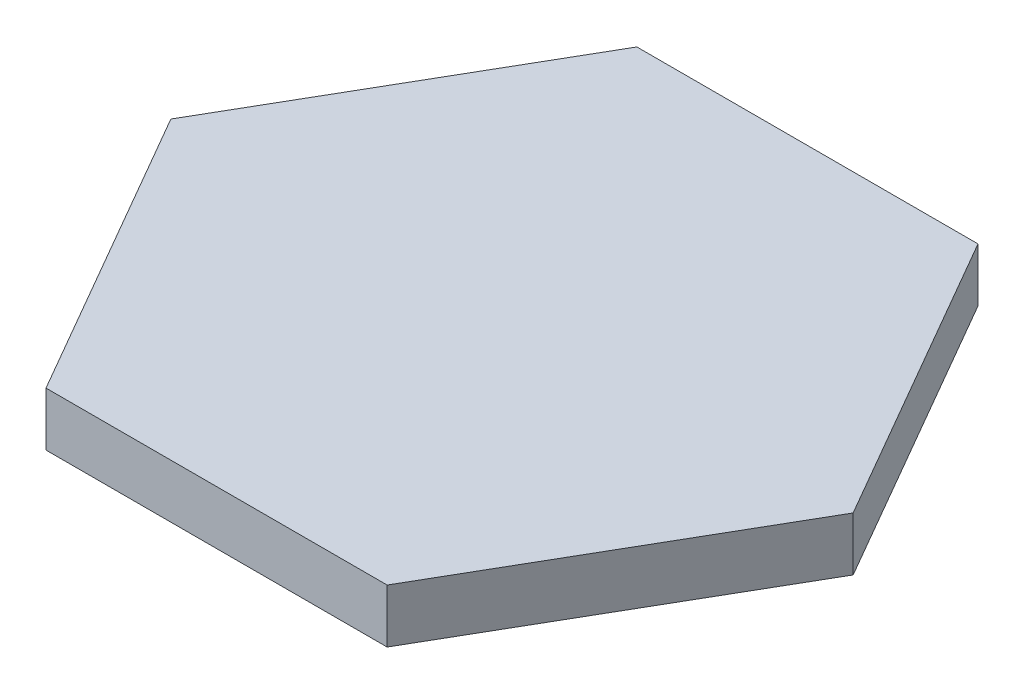
ISO-10303-21;
HEADER;
FILE_DESCRIPTION(('STEP AP214'),'2;1');
FILE_NAME('part.step','',(''),(''),'','','');
FILE_SCHEMA(('AUTOMOTIVE_DESIGN { 1 0 10303 214 1 1 1 1 }'));
ENDSEC;
DATA;
#1=APPLICATION_CONTEXT('core data for automotive mechanical design processes');
#2=APPLICATION_PROTOCOL_DEFINITION('international standard','automotive_design',2000,#1);
#3=PRODUCT_CONTEXT('',#1,'mechanical');
#4=PRODUCT('Part','Part','',(#3));
#5=PRODUCT_RELATED_PRODUCT_CATEGORY('part','',(#4));
#6=PRODUCT_DEFINITION_FORMATION('','',#4);
#7=PRODUCT_DEFINITION_CONTEXT('part definition',#1,'design');
#8=PRODUCT_DEFINITION('design','',#6,#7);
#9=PRODUCT_DEFINITION_SHAPE('','',#8);
#10=(LENGTH_UNIT() NAMED_UNIT(*) SI_UNIT(.MILLI.,.METRE.));
#11=(NAMED_UNIT(*) PLANE_ANGLE_UNIT() SI_UNIT($,.RADIAN.));
#12=(NAMED_UNIT(*) SI_UNIT($,.STERADIAN.) SOLID_ANGLE_UNIT());
#13=UNCERTAINTY_MEASURE_WITH_UNIT(LENGTH_MEASURE(1.E-05),#10,'distance_accuracy_value','');
#14=(GEOMETRIC_REPRESENTATION_CONTEXT(3) GLOBAL_UNCERTAINTY_ASSIGNED_CONTEXT((#13)) GLOBAL_UNIT_ASSIGNED_CONTEXT((#10,
#11,#12)) REPRESENTATION_CONTEXT('',''));
#15=CARTESIAN_POINT('',(0.,0.,0.));
#16=DIRECTION('',(0.,0.,1.));
#17=DIRECTION('',(1.,0.,0.));
#18=AXIS2_PLACEMENT_3D('',#15,#16,#17);
#19=CARTESIAN_POINT('',(-40.3279163028954,12.7,69.85));
#20=DIRECTION('',(0.,0.,-1.));
#21=DIRECTION('',(-1.,0.,0.));
#22=AXIS2_PLACEMENT_3D('',#19,#20,#21);
#23=PLANE('',#22);
#24=DIRECTION('',(1.,0.,0.));
#25=VECTOR('',#24,1.);
#26=CARTESIAN_POINT('',(-40.3279163028954,0.,69.85));
#27=LINE('',#26,#25);
#28=CARTESIAN_POINT('',(-40.3279163028954,0.,69.85));
#29=VERTEX_POINT('',#28);
#30=CARTESIAN_POINT('',(40.3279163028954,0.,69.85));
#31=VERTEX_POINT('',#30);
#32=EDGE_CURVE('E140',#29,#31,#27,.T.);
#33=ORIENTED_EDGE('',*,*,#32,.T.);
#34=DIRECTION('',(0.,-1.,0.));
#35=VECTOR('',#34,1.);
#36=CARTESIAN_POINT('',(40.3279163028954,12.7,69.85));
#37=LINE('',#36,#35);
#38=CARTESIAN_POINT('',(40.3279163028954,12.7,69.85));
#39=VERTEX_POINT('',#38);
#40=EDGE_CURVE('E11',#39,#31,#37,.T.);
#41=ORIENTED_EDGE('',*,*,#40,.F.);
#42=DIRECTION('',(1.,0.,0.));
#43=VECTOR('',#42,1.);
#44=CARTESIAN_POINT('',(-40.3279163028954,12.7,69.85));
#45=LINE('',#44,#43);
#46=CARTESIAN_POINT('',(-40.3279163028954,12.7,69.85));
#47=VERTEX_POINT('',#46);
#48=EDGE_CURVE('E156',#47,#39,#45,.T.);
#49=ORIENTED_EDGE('',*,*,#48,.F.);
#50=DIRECTION('',(0.,-1.,0.));
#51=VECTOR('',#50,1.);
#52=CARTESIAN_POINT('',(-40.3279163028954,12.7,69.85));
#53=LINE('',#52,#51);
#54=EDGE_CURVE('E136',#47,#29,#53,.T.);
#55=ORIENTED_EDGE('',*,*,#54,.T.);
#56=EDGE_LOOP('',(#33,#41,#49,#55));
#57=FACE_BOUND('',#56,.T.);
#58=ADVANCED_FACE('F51',(#57),#23,.F.);
#59=CARTESIAN_POINT('',(40.3279163028954,12.7,69.85));
#60=DIRECTION('',(-0.866025403784439,0.,-0.5));
#61=DIRECTION('',(-0.5,0.,0.866025403784439));
#62=AXIS2_PLACEMENT_3D('',#59,#60,#61);
#63=PLANE('',#62);
#64=DIRECTION('',(0.5,0.,-0.866025403784439));
#65=VECTOR('',#64,1.);
#66=CARTESIAN_POINT('',(40.3279163028954,0.,69.85));
#67=LINE('',#66,#65);
#68=CARTESIAN_POINT('',(80.6558326057907,0.,0.));
#69=VERTEX_POINT('',#68);
#70=EDGE_CURVE('E144',#31,#69,#67,.T.);
#71=ORIENTED_EDGE('',*,*,#70,.T.);
#72=DIRECTION('',(0.,-1.,0.));
#73=VECTOR('',#72,1.);
#74=CARTESIAN_POINT('',(80.6558326057907,12.7,0.));
#75=LINE('',#74,#73);
#76=CARTESIAN_POINT('',(80.6558326057907,12.7,0.));
#77=VERTEX_POINT('',#76);
#78=EDGE_CURVE('E60',#77,#69,#75,.T.);
#79=ORIENTED_EDGE('',*,*,#78,.F.);
#80=DIRECTION('',(0.5,0.,-0.866025403784439));
#81=VECTOR('',#80,1.);
#82=CARTESIAN_POINT('',(40.3279163028954,12.7,69.85));
#83=LINE('',#82,#81);
#84=EDGE_CURVE('E105',#39,#77,#83,.T.);
#85=ORIENTED_EDGE('',*,*,#84,.F.);
#86=ORIENTED_EDGE('',*,*,#40,.T.);
#87=EDGE_LOOP('',(#71,#79,#85,#86));
#88=FACE_BOUND('',#87,.T.);
#89=ADVANCED_FACE('F184',(#88),#63,.F.);
#90=CARTESIAN_POINT('',(80.6558326057907,12.7,0.));
#91=DIRECTION('',(-0.866025403784438,0.,0.5));
#92=DIRECTION('',(0.5,0.,0.866025403784438));
#93=AXIS2_PLACEMENT_3D('',#90,#91,#92);
#94=PLANE('',#93);
#95=DIRECTION('',(-0.5,0.,-0.866025403784438));
#96=VECTOR('',#95,1.);
#97=CARTESIAN_POINT('',(80.6558326057907,0.,0.));
#98=LINE('',#97,#96);
#99=CARTESIAN_POINT('',(40.3279163028953,0.,-69.85));
#100=VERTEX_POINT('',#99);
#101=EDGE_CURVE('E147',#69,#100,#98,.T.);
#102=ORIENTED_EDGE('',*,*,#101,.T.);
#103=DIRECTION('',(0.,-1.,0.));
#104=VECTOR('',#103,1.);
#105=CARTESIAN_POINT('',(40.3279163028953,12.7,-69.85));
#106=LINE('',#105,#104);
#107=CARTESIAN_POINT('',(40.3279163028953,12.7,-69.85));
#108=VERTEX_POINT('',#107);
#109=EDGE_CURVE('E129',#108,#100,#106,.T.);
#110=ORIENTED_EDGE('',*,*,#109,.F.);
#111=DIRECTION('',(-0.5,0.,-0.866025403784438));
#112=VECTOR('',#111,1.);
#113=CARTESIAN_POINT('',(80.6558326057907,12.7,0.));
#114=LINE('',#113,#112);
#115=EDGE_CURVE('E118',#77,#108,#114,.T.);
#116=ORIENTED_EDGE('',*,*,#115,.F.);
#117=ORIENTED_EDGE('',*,*,#78,.T.);
#118=EDGE_LOOP('',(#102,#110,#116,#117));
#119=FACE_BOUND('',#118,.T.);
#120=ADVANCED_FACE('F166',(#119),#94,.F.);
#121=CARTESIAN_POINT('',(40.3279163028953,12.7,-69.85));
#122=DIRECTION('',(0.,0.,1.));
#123=DIRECTION('',(1.,0.,0.));
#124=AXIS2_PLACEMENT_3D('',#121,#122,#123);
#125=PLANE('',#124);
#126=DIRECTION('',(-1.,0.,0.));
#127=VECTOR('',#126,1.);
#128=CARTESIAN_POINT('',(40.3279163028953,0.,-69.85));
#129=LINE('',#128,#127);
#130=CARTESIAN_POINT('',(-40.3279163028954,0.,-69.85));
#131=VERTEX_POINT('',#130);
#132=EDGE_CURVE('E127',#100,#131,#129,.T.);
#133=ORIENTED_EDGE('',*,*,#132,.T.);
#134=DIRECTION('',(0.,-1.,0.));
#135=VECTOR('',#134,1.);
#136=CARTESIAN_POINT('',(-40.3279163028954,12.7,-69.85));
#137=LINE('',#136,#135);
#138=CARTESIAN_POINT('',(-40.3279163028954,12.7,-69.85));
#139=VERTEX_POINT('',#138);
#140=EDGE_CURVE('E124',#139,#131,#137,.T.);
#141=ORIENTED_EDGE('',*,*,#140,.F.);
#142=DIRECTION('',(-1.,0.,0.));
#143=VECTOR('',#142,1.);
#144=CARTESIAN_POINT('',(40.3279163028953,12.7,-69.85));
#145=LINE('',#144,#143);
#146=EDGE_CURVE('E112',#108,#139,#145,.T.);
#147=ORIENTED_EDGE('',*,*,#146,.F.);
#148=ORIENTED_EDGE('',*,*,#109,.T.);
#149=EDGE_LOOP('',(#133,#141,#147,#148));
#150=FACE_BOUND('',#149,.T.);
#151=ADVANCED_FACE('F125',(#150),#125,.F.);
#152=CARTESIAN_POINT('',(-40.3279163028954,12.7,-69.85));
#153=DIRECTION('',(0.866025403784439,0.,0.5));
#154=DIRECTION('',(0.5,0.,-0.866025403784439));
#155=AXIS2_PLACEMENT_3D('',#152,#153,#154);
#156=PLANE('',#155);
#157=DIRECTION('',(-0.5,0.,0.866025403784439));
#158=VECTOR('',#157,1.);
#159=CARTESIAN_POINT('',(-40.3279163028954,0.,-69.85));
#160=LINE('',#159,#158);
#161=CARTESIAN_POINT('',(-80.6558326057907,0.,0.));
#162=VERTEX_POINT('',#161);
#163=EDGE_CURVE('E91',#131,#162,#160,.T.);
#164=ORIENTED_EDGE('',*,*,#163,.T.);
#165=DIRECTION('',(0.,-1.,0.));
#166=VECTOR('',#165,1.);
#167=CARTESIAN_POINT('',(-80.6558326057907,12.7,0.));
#168=LINE('',#167,#166);
#169=CARTESIAN_POINT('',(-80.6558326057907,12.7,0.));
#170=VERTEX_POINT('',#169);
#171=EDGE_CURVE('E130',#170,#162,#168,.T.);
#172=ORIENTED_EDGE('',*,*,#171,.F.);
#173=DIRECTION('',(-0.5,0.,0.866025403784439));
#174=VECTOR('',#173,1.);
#175=CARTESIAN_POINT('',(-40.3279163028954,12.7,-69.85));
#176=LINE('',#175,#174);
#177=EDGE_CURVE('E116',#139,#170,#176,.T.);
#178=ORIENTED_EDGE('',*,*,#177,.F.);
#179=ORIENTED_EDGE('',*,*,#140,.T.);
#180=EDGE_LOOP('',(#164,#172,#178,#179));
#181=FACE_BOUND('',#180,.T.);
#182=ADVANCED_FACE('F132',(#181),#156,.F.);
#183=CARTESIAN_POINT('',(-80.6558326057907,12.7,0.));
#184=DIRECTION('',(0.866025403784439,0.,-0.5));
#185=DIRECTION('',(-0.5,0.,-0.866025403784439));
#186=AXIS2_PLACEMENT_3D('',#183,#184,#185);
#187=PLANE('',#186);
#188=DIRECTION('',(0.5,0.,0.866025403784439));
#189=VECTOR('',#188,1.);
#190=CARTESIAN_POINT('',(-80.6558326057907,0.,0.));
#191=LINE('',#190,#189);
#192=EDGE_CURVE('E97',#162,#29,#191,.T.);
#193=ORIENTED_EDGE('',*,*,#192,.T.);
#194=ORIENTED_EDGE('',*,*,#54,.F.);
#195=DIRECTION('',(0.5,0.,0.866025403784439));
#196=VECTOR('',#195,1.);
#197=CARTESIAN_POINT('',(-80.6558326057907,12.7,0.));
#198=LINE('',#197,#196);
#199=EDGE_CURVE('E68',#170,#47,#198,.T.);
#200=ORIENTED_EDGE('',*,*,#199,.F.);
#201=ORIENTED_EDGE('',*,*,#171,.T.);
#202=EDGE_LOOP('',(#193,#194,#200,#201));
#203=FACE_BOUND('',#202,.T.);
#204=ADVANCED_FACE('F173',(#203),#187,.F.);
#205=CARTESIAN_POINT('',(0.,12.7,0.));
#206=DIRECTION('',(0.,1.,0.));
#207=DIRECTION('',(0.,0.,1.));
#208=AXIS2_PLACEMENT_3D('',#205,#206,#207);
#209=PLANE('',#208);
#210=ORIENTED_EDGE('',*,*,#48,.T.);
#211=ORIENTED_EDGE('',*,*,#84,.T.);
#212=ORIENTED_EDGE('',*,*,#115,.T.);
#213=ORIENTED_EDGE('',*,*,#146,.T.);
#214=ORIENTED_EDGE('',*,*,#177,.T.);
#215=ORIENTED_EDGE('',*,*,#199,.T.);
#216=EDGE_LOOP('',(#210,#211,#212,#213,#214,#215));
#217=FACE_BOUND('',#216,.T.);
#218=ADVANCED_FACE('F114',(#217),#209,.T.);
#219=CARTESIAN_POINT('',(0.,0.,0.));
#220=DIRECTION('',(0.,1.,0.));
#221=DIRECTION('',(0.,0.,1.));
#222=AXIS2_PLACEMENT_3D('',#219,#220,#221);
#223=PLANE('',#222);
#224=ORIENTED_EDGE('',*,*,#32,.F.);
#225=ORIENTED_EDGE('',*,*,#192,.F.);
#226=ORIENTED_EDGE('',*,*,#163,.F.);
#227=ORIENTED_EDGE('',*,*,#132,.F.);
#228=ORIENTED_EDGE('',*,*,#101,.F.);
#229=ORIENTED_EDGE('',*,*,#70,.F.);
#230=EDGE_LOOP('',(#224,#225,#226,#227,#228,#229));
#231=FACE_BOUND('',#230,.T.);
#232=ADVANCED_FACE('F169',(#231),#223,.F.);
#233=CLOSED_SHELL('',(#58,#89,#120,#151,#182,#204,#218,#232));
#234=MANIFOLD_SOLID_BREP('B2',#233);
#235=ADVANCED_BREP_SHAPE_REPRESENTATION('',(#18,#234),#14);
#236=SHAPE_DEFINITION_REPRESENTATION(#9,#235);
ENDSEC;
END-ISO-10303-21;
